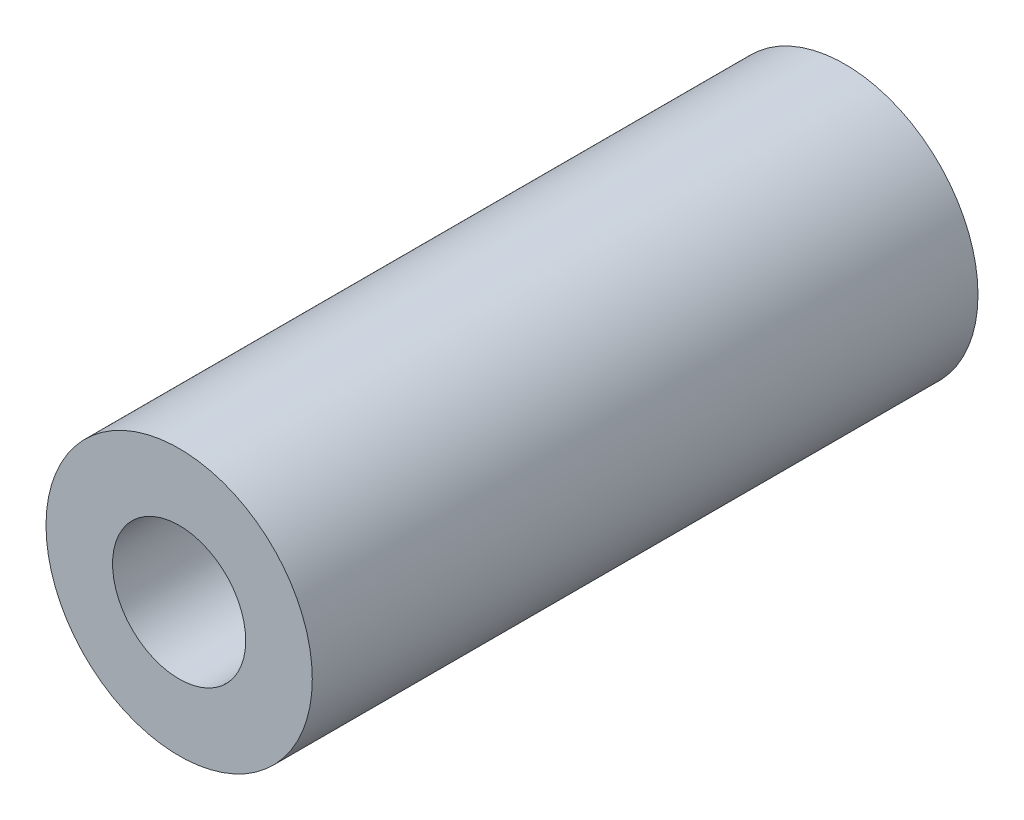
ISO-10303-21;
HEADER;
FILE_DESCRIPTION(('STEP AP214'),'2;1');
FILE_NAME('part.step','',(''),(''),'','','');
FILE_SCHEMA(('AUTOMOTIVE_DESIGN { 1 0 10303 214 1 1 1 1 }'));
ENDSEC;
DATA;
#1=APPLICATION_CONTEXT('core data for automotive mechanical design processes');
#2=APPLICATION_PROTOCOL_DEFINITION('international standard','automotive_design',2000,#1);
#3=PRODUCT_CONTEXT('',#1,'mechanical');
#4=PRODUCT('Part','Part','',(#3));
#5=PRODUCT_RELATED_PRODUCT_CATEGORY('part','',(#4));
#6=PRODUCT_DEFINITION_FORMATION('','',#4);
#7=PRODUCT_DEFINITION_CONTEXT('part definition',#1,'design');
#8=PRODUCT_DEFINITION('design','',#6,#7);
#9=PRODUCT_DEFINITION_SHAPE('','',#8);
#10=(LENGTH_UNIT() NAMED_UNIT(*) SI_UNIT(.MILLI.,.METRE.));
#11=(NAMED_UNIT(*) PLANE_ANGLE_UNIT() SI_UNIT($,.RADIAN.));
#12=(NAMED_UNIT(*) SI_UNIT($,.STERADIAN.) SOLID_ANGLE_UNIT());
#13=UNCERTAINTY_MEASURE_WITH_UNIT(LENGTH_MEASURE(1.E-05),#10,'distance_accuracy_value','');
#14=(GEOMETRIC_REPRESENTATION_CONTEXT(3) GLOBAL_UNCERTAINTY_ASSIGNED_CONTEXT((#13)) GLOBAL_UNIT_ASSIGNED_CONTEXT((#10,
#11,#12)) REPRESENTATION_CONTEXT('',''));
#15=CARTESIAN_POINT('',(0.,0.,0.));
#16=DIRECTION('',(0.,0.,1.));
#17=DIRECTION('',(1.,0.,0.));
#18=AXIS2_PLACEMENT_3D('',#15,#16,#17);
#19=CARTESIAN_POINT('',(0.,0.,15.875));
#20=DIRECTION('',(0.,0.,1.));
#21=DIRECTION('',(1.,0.,0.));
#22=AXIS2_PLACEMENT_3D('',#19,#20,#21);
#23=PLANE('',#22);
#24=CARTESIAN_POINT('',(0.,0.,15.875));
#25=DIRECTION('',(0.,0.,1.));
#26=DIRECTION('',(1.,0.,0.));
#27=AXIS2_PLACEMENT_3D('',#24,#25,#26);
#28=CIRCLE('',#27,3.175);
#29=CARTESIAN_POINT('',(3.175,0.,15.875));
#30=VERTEX_POINT('',#29);
#31=EDGE_CURVE('E10',#30,#30,#28,.T.);
#32=ORIENTED_EDGE('',*,*,#31,.T.);
#33=EDGE_LOOP('',(#32));
#34=FACE_BOUND('',#33,.T.);
#35=CARTESIAN_POINT('',(0.,0.,15.875));
#36=DIRECTION('',(0.,0.,1.));
#37=DIRECTION('',(1.,0.,0.));
#38=AXIS2_PLACEMENT_3D('',#35,#36,#37);
#39=CIRCLE('',#38,1.5875);
#40=CARTESIAN_POINT('',(1.5875,0.,15.875));
#41=VERTEX_POINT('',#40);
#42=EDGE_CURVE('E42',#41,#41,#39,.T.);
#43=ORIENTED_EDGE('',*,*,#42,.F.);
#44=EDGE_LOOP('',(#43));
#45=FACE_BOUND('',#44,.T.);
#46=ADVANCED_FACE('F31',(#34,#45),#23,.T.);
#47=CARTESIAN_POINT('',(0.,0.,0.));
#48=DIRECTION('',(0.,0.,1.));
#49=DIRECTION('',(1.,0.,0.));
#50=AXIS2_PLACEMENT_3D('',#47,#48,#49);
#51=PLANE('',#50);
#52=CARTESIAN_POINT('',(0.,0.,0.));
#53=DIRECTION('',(0.,0.,1.));
#54=DIRECTION('',(1.,0.,0.));
#55=AXIS2_PLACEMENT_3D('',#52,#53,#54);
#56=CIRCLE('',#55,3.175);
#57=CARTESIAN_POINT('',(3.175,0.,0.));
#58=VERTEX_POINT('',#57);
#59=EDGE_CURVE('E35',#58,#58,#56,.T.);
#60=ORIENTED_EDGE('',*,*,#59,.F.);
#61=EDGE_LOOP('',(#60));
#62=FACE_BOUND('',#61,.T.);
#63=CARTESIAN_POINT('',(0.,0.,0.));
#64=DIRECTION('',(0.,0.,1.));
#65=DIRECTION('',(1.,0.,0.));
#66=AXIS2_PLACEMENT_3D('',#63,#64,#65);
#67=CIRCLE('',#66,1.5875);
#68=CARTESIAN_POINT('',(1.5875,0.,0.));
#69=VERTEX_POINT('',#68);
#70=EDGE_CURVE('E44',#69,#69,#67,.T.);
#71=ORIENTED_EDGE('',*,*,#70,.T.);
#72=EDGE_LOOP('',(#71));
#73=FACE_BOUND('',#72,.T.);
#74=ADVANCED_FACE('F54',(#62,#73),#51,.F.);
#75=CARTESIAN_POINT('',(0.,0.,15.875));
#76=DIRECTION('',(0.,0.,-1.));
#77=DIRECTION('',(-1.,0.,0.));
#78=AXIS2_PLACEMENT_3D('',#75,#76,#77);
#79=CYLINDRICAL_SURFACE('',#78,3.175);
#80=ORIENTED_EDGE('',*,*,#31,.F.);
#81=EDGE_LOOP('',(#80));
#82=FACE_BOUND('',#81,.T.);
#83=ORIENTED_EDGE('',*,*,#59,.T.);
#84=EDGE_LOOP('',(#83));
#85=FACE_BOUND('',#84,.T.);
#86=ADVANCED_FACE('F33',(#82,#85),#79,.T.);
#87=CARTESIAN_POINT('',(0.,0.,15.875));
#88=DIRECTION('',(0.,0.,-1.));
#89=DIRECTION('',(-1.,0.,0.));
#90=AXIS2_PLACEMENT_3D('',#87,#88,#89);
#91=CYLINDRICAL_SURFACE('',#90,1.5875);
#92=ORIENTED_EDGE('',*,*,#42,.T.);
#93=EDGE_LOOP('',(#92));
#94=FACE_BOUND('',#93,.T.);
#95=ORIENTED_EDGE('',*,*,#70,.F.);
#96=EDGE_LOOP('',(#95));
#97=FACE_BOUND('',#96,.T.);
#98=ADVANCED_FACE('F50',(#94,#97),#91,.F.);
#99=CLOSED_SHELL('',(#46,#74,#86,#98));
#100=MANIFOLD_SOLID_BREP('B2',#99);
#101=ADVANCED_BREP_SHAPE_REPRESENTATION('',(#18,#100),#14);
#102=SHAPE_DEFINITION_REPRESENTATION(#9,#101);
ENDSEC;
END-ISO-10303-21;
